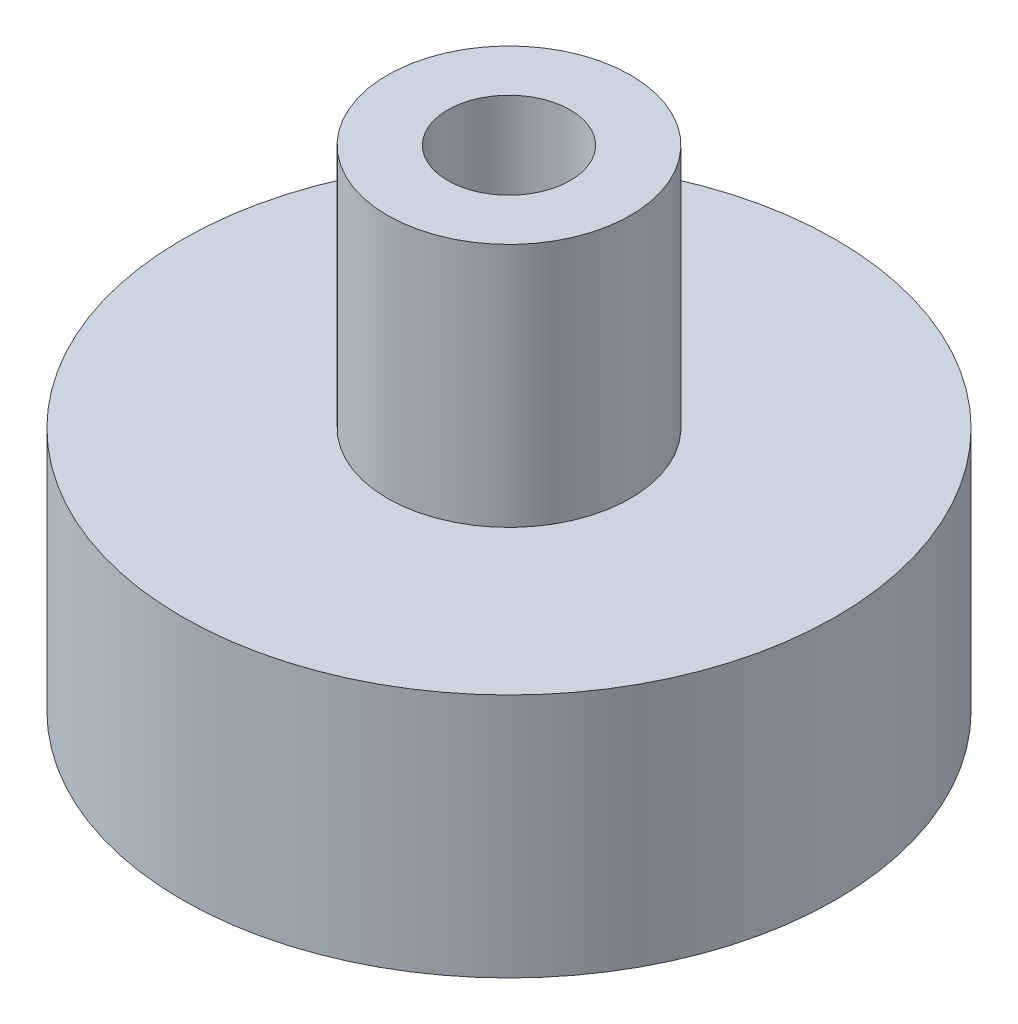
ISO-10303-21;
HEADER;
FILE_DESCRIPTION(('STEP AP214'),'2;1');
FILE_NAME('part.step','',(''),(''),'','','');
FILE_SCHEMA(('AUTOMOTIVE_DESIGN { 1 0 10303 214 1 1 1 1 }'));
ENDSEC;
DATA;
#1=APPLICATION_CONTEXT('core data for automotive mechanical design processes');
#2=APPLICATION_PROTOCOL_DEFINITION('international standard','automotive_design',2000,#1);
#3=PRODUCT_CONTEXT('',#1,'mechanical');
#4=PRODUCT('Part','Part','',(#3));
#5=PRODUCT_RELATED_PRODUCT_CATEGORY('part','',(#4));
#6=PRODUCT_DEFINITION_FORMATION('','',#4);
#7=PRODUCT_DEFINITION_CONTEXT('part definition',#1,'design');
#8=PRODUCT_DEFINITION('design','',#6,#7);
#9=PRODUCT_DEFINITION_SHAPE('','',#8);
#10=(LENGTH_UNIT() NAMED_UNIT(*) SI_UNIT(.MILLI.,.METRE.));
#11=(NAMED_UNIT(*) PLANE_ANGLE_UNIT() SI_UNIT($,.RADIAN.));
#12=(NAMED_UNIT(*) SI_UNIT($,.STERADIAN.) SOLID_ANGLE_UNIT());
#13=UNCERTAINTY_MEASURE_WITH_UNIT(LENGTH_MEASURE(1.E-05),#10,'distance_accuracy_value','');
#14=(GEOMETRIC_REPRESENTATION_CONTEXT(3) GLOBAL_UNCERTAINTY_ASSIGNED_CONTEXT((#13)) GLOBAL_UNIT_ASSIGNED_CONTEXT((#10,
#11,#12)) REPRESENTATION_CONTEXT('',''));
#15=CARTESIAN_POINT('',(0.,0.,0.));
#16=DIRECTION('',(0.,0.,1.));
#17=DIRECTION('',(1.,0.,0.));
#18=AXIS2_PLACEMENT_3D('',#15,#16,#17);
#19=CARTESIAN_POINT('',(-27.9181268796598,4.7625,5.99101435185832));
#20=DIRECTION('',(0.,1.,0.));
#21=DIRECTION('',(0.,0.,1.));
#22=AXIS2_PLACEMENT_3D('',#19,#20,#21);
#23=PLANE('',#22);
#24=CARTESIAN_POINT('',(-27.9181268796598,4.7625,5.99101435185832));
#25=DIRECTION('',(0.,1.,0.));
#26=DIRECTION('',(0.,0.,1.));
#27=AXIS2_PLACEMENT_3D('',#24,#25,#26);
#28=CIRCLE('',#27,6.35);
#29=CARTESIAN_POINT('',(-27.9181268796598,4.7625,-0.358985648141679));
#30=VERTEX_POINT('',#29);
#31=EDGE_CURVE('E10',#30,#30,#28,.T.);
#32=ORIENTED_EDGE('',*,*,#31,.T.);
#33=EDGE_LOOP('',(#32));
#34=FACE_BOUND('',#33,.T.);
#35=CARTESIAN_POINT('',(-27.9181268796598,4.7625,5.99101435185832));
#36=DIRECTION('',(0.,1.,0.));
#37=DIRECTION('',(0.,0.,1.));
#38=AXIS2_PLACEMENT_3D('',#35,#36,#37);
#39=CIRCLE('',#38,2.3622);
#40=CARTESIAN_POINT('',(-27.9181268796598,4.7625,8.35321435185833));
#41=VERTEX_POINT('',#40);
#42=EDGE_CURVE('E55',#41,#41,#39,.F.);
#43=ORIENTED_EDGE('',*,*,#42,.T.);
#44=EDGE_LOOP('',(#43));
#45=FACE_BOUND('',#44,.T.);
#46=ADVANCED_FACE('F37',(#34,#45),#23,.T.);
#47=CARTESIAN_POINT('',(-27.9181268796598,0.,5.99101435185832));
#48=DIRECTION('',(0.,1.,0.));
#49=DIRECTION('',(0.,0.,1.));
#50=AXIS2_PLACEMENT_3D('',#47,#48,#49);
#51=PLANE('',#50);
#52=CARTESIAN_POINT('',(-27.9181268796598,0.,5.99101435185832));
#53=DIRECTION('',(0.,1.,0.));
#54=DIRECTION('',(0.,0.,1.));
#55=AXIS2_PLACEMENT_3D('',#52,#53,#54);
#56=CIRCLE('',#55,1.190625);
#57=CARTESIAN_POINT('',(-27.9181268796598,0.,4.80038935185832));
#58=VERTEX_POINT('',#57);
#59=EDGE_CURVE('E50',#58,#58,#56,.T.);
#60=ORIENTED_EDGE('',*,*,#59,.T.);
#61=EDGE_LOOP('',(#60));
#62=FACE_BOUND('',#61,.T.);
#63=CARTESIAN_POINT('',(-27.9181268796598,0.,5.99101435185832));
#64=DIRECTION('',(0.,1.,0.));
#65=DIRECTION('',(0.,0.,1.));
#66=AXIS2_PLACEMENT_3D('',#63,#64,#65);
#67=CIRCLE('',#66,6.35);
#68=CARTESIAN_POINT('',(-27.9181268796598,0.,-0.358985648141679));
#69=VERTEX_POINT('',#68);
#70=EDGE_CURVE('E41',#69,#69,#67,.T.);
#71=ORIENTED_EDGE('',*,*,#70,.F.);
#72=EDGE_LOOP('',(#71));
#73=FACE_BOUND('',#72,.T.);
#74=ADVANCED_FACE('F84',(#62,#73),#51,.F.);
#75=CARTESIAN_POINT('',(-27.9181268796598,4.7625,5.99101435185832));
#76=DIRECTION('',(0.,-1.,0.));
#77=DIRECTION('',(0.,0.,-1.));
#78=AXIS2_PLACEMENT_3D('',#75,#76,#77);
#79=CYLINDRICAL_SURFACE('',#78,6.35);
#80=CARTESIAN_POINT('',(-27.9181268796598,4.7625,-0.358985648141679));
#81=CARTESIAN_POINT('',(-27.9181268796598,4.712890625,-0.358985648141679));
#82=CARTESIAN_POINT('',(-27.9181268796598,4.66328125,-0.358985648141679));
#83=CARTESIAN_POINT('',(-27.9181268796598,4.5640625,-0.358985648141679));
#84=CARTESIAN_POINT('',(-27.9181268796598,4.514453125,-0.358985648141679));
#85=CARTESIAN_POINT('',(-27.9181268796598,4.415234375,-0.358985648141679));
#86=CARTESIAN_POINT('',(-27.9181268796598,4.365625,-0.358985648141679));
#87=CARTESIAN_POINT('',(-27.9181268796598,4.26640625,-0.358985648141679));
#88=CARTESIAN_POINT('',(-27.9181268796598,4.216796875,-0.358985648141679));
#89=CARTESIAN_POINT('',(-27.9181268796598,4.117578125,-0.358985648141679));
#90=CARTESIAN_POINT('',(-27.9181268796598,4.06796875,-0.358985648141679));
#91=CARTESIAN_POINT('',(-27.9181268796598,3.96875,-0.358985648141679));
#92=CARTESIAN_POINT('',(-27.9181268796598,3.919140625,-0.358985648141679));
#93=CARTESIAN_POINT('',(-27.9181268796598,3.819921875,-0.358985648141679));
#94=CARTESIAN_POINT('',(-27.9181268796598,3.7703125,-0.358985648141679));
#95=CARTESIAN_POINT('',(-27.9181268796598,3.67109375,-0.358985648141679));
#96=CARTESIAN_POINT('',(-27.9181268796598,3.621484375,-0.358985648141679));
#97=CARTESIAN_POINT('',(-27.9181268796598,3.522265625,-0.358985648141679));
#98=CARTESIAN_POINT('',(-27.9181268796598,3.47265625,-0.358985648141679));
#99=CARTESIAN_POINT('',(-27.9181268796598,3.3734375,-0.358985648141679));
#100=CARTESIAN_POINT('',(-27.9181268796598,3.323828125,-0.358985648141679));
#101=CARTESIAN_POINT('',(-27.9181268796598,3.224609375,-0.358985648141679));
#102=CARTESIAN_POINT('',(-27.9181268796598,3.175,-0.358985648141679));
#103=CARTESIAN_POINT('',(-27.9181268796598,3.07578125,-0.358985648141679));
#104=CARTESIAN_POINT('',(-27.9181268796598,3.026171875,-0.358985648141679));
#105=CARTESIAN_POINT('',(-27.9181268796598,2.926953125,-0.358985648141679));
#106=CARTESIAN_POINT('',(-27.9181268796598,2.87734375,-0.358985648141679));
#107=CARTESIAN_POINT('',(-27.9181268796598,2.778125,-0.358985648141679));
#108=CARTESIAN_POINT('',(-27.9181268796598,2.728515625,-0.358985648141679));
#109=CARTESIAN_POINT('',(-27.9181268796598,2.629296875,-0.358985648141679));
#110=CARTESIAN_POINT('',(-27.9181268796598,2.5796875,-0.358985648141679));
#111=CARTESIAN_POINT('',(-27.9181268796598,2.48046875,-0.358985648141679));
#112=CARTESIAN_POINT('',(-27.9181268796598,2.430859375,-0.358985648141679));
#113=CARTESIAN_POINT('',(-27.9181268796598,2.331640625,-0.358985648141679));
#114=CARTESIAN_POINT('',(-27.9181268796598,2.28203125,-0.358985648141679));
#115=CARTESIAN_POINT('',(-27.9181268796598,2.1828125,-0.358985648141679));
#116=CARTESIAN_POINT('',(-27.9181268796598,2.133203125,-0.358985648141679));
#117=CARTESIAN_POINT('',(-27.9181268796598,2.033984375,-0.358985648141679));
#118=CARTESIAN_POINT('',(-27.9181268796598,1.984375,-0.358985648141679));
#119=CARTESIAN_POINT('',(-27.9181268796598,1.88515625,-0.358985648141679));
#120=CARTESIAN_POINT('',(-27.9181268796598,1.835546875,-0.358985648141679));
#121=CARTESIAN_POINT('',(-27.9181268796598,1.736328125,-0.358985648141679));
#122=CARTESIAN_POINT('',(-27.9181268796598,1.68671875,-0.358985648141679));
#123=CARTESIAN_POINT('',(-27.9181268796598,1.5875,-0.358985648141679));
#124=CARTESIAN_POINT('',(-27.9181268796598,1.537890625,-0.358985648141679));
#125=CARTESIAN_POINT('',(-27.9181268796598,1.438671875,-0.358985648141679));
#126=CARTESIAN_POINT('',(-27.9181268796598,1.3890625,-0.358985648141679));
#127=CARTESIAN_POINT('',(-27.9181268796598,1.28984375,-0.358985648141679));
#128=CARTESIAN_POINT('',(-27.9181268796598,1.240234375,-0.358985648141679));
#129=CARTESIAN_POINT('',(-27.9181268796598,1.141015625,-0.358985648141679));
#130=CARTESIAN_POINT('',(-27.9181268796598,1.09140625,-0.358985648141679));
#131=CARTESIAN_POINT('',(-27.9181268796598,0.992187499999999,-0.358985648141679));
#132=CARTESIAN_POINT('',(-27.9181268796598,0.942578124999999,-0.358985648141679));
#133=CARTESIAN_POINT('',(-27.9181268796598,0.843359375,-0.358985648141679));
#134=CARTESIAN_POINT('',(-27.9181268796598,0.79375,-0.358985648141679));
#135=CARTESIAN_POINT('',(-27.9181268796598,0.69453125,-0.358985648141679));
#136=CARTESIAN_POINT('',(-27.9181268796598,0.644921875,-0.358985648141679));
#137=CARTESIAN_POINT('',(-27.9181268796598,0.545703125,-0.358985648141679));
#138=CARTESIAN_POINT('',(-27.9181268796598,0.49609375,-0.358985648141679));
#139=CARTESIAN_POINT('',(-27.9181268796598,0.396875,-0.358985648141679));
#140=CARTESIAN_POINT('',(-27.9181268796598,0.347265625,-0.358985648141679));
#141=CARTESIAN_POINT('',(-27.9181268796598,0.248046875,-0.358985648141679));
#142=CARTESIAN_POINT('',(-27.9181268796598,0.1984375,-0.358985648141679));
#143=CARTESIAN_POINT('',(-27.9181268796598,0.09921875,-0.358985648141679));
#144=CARTESIAN_POINT('',(-27.9181268796598,0.049609375,-0.358985648141679));
#145=CARTESIAN_POINT('',(-27.9181268796598,0.,-0.358985648141679));
#146=B_SPLINE_CURVE_WITH_KNOTS('',3,(#80,#81,#82,#83,#84,#85,#86,#87,#88,#89,#90,#91,#92,#93,
#94,#95,#96,#97,#98,#99,#100,#101,#102,#103,#104,#105,#106,#107,#108,#109,#110,#111,#112,#113,
#114,#115,#116,#117,#118,#119,#120,#121,#122,#123,#124,#125,#126,#127,#128,#129,#130,#131,#132,
#133,#134,#135,#136,#137,#138,#139,#140,#141,#142,#143,#144,#145),.UNSPECIFIED.,.F.,.F.,(4,2,2,
2,2,2,2,2,2,2,2,2,2,2,2,2,2,2,2,2,2,2,2,2,2,2,2,2,2,2,2,2,4),(0.,0.148828125,0.29765625,
0.446484375,0.5953125,0.744140625,0.892968750000001,1.041796875,1.190625,1.339453125,1.48828125,
1.637109375,1.7859375,1.934765625,2.08359375,2.232421875,2.38125,2.530078125,2.67890625,
2.827734375,2.9765625,3.125390625,3.27421875,3.423046875,3.571875,3.720703125,3.86953125,
4.018359375,4.1671875,4.316015625,4.46484375,4.613671875,4.7625),.UNSPECIFIED.);
#147=EDGE_CURVE('BSEAM39',#30,#69,#146,.T.);
#148=ORIENTED_EDGE('',*,*,#31,.F.);
#149=ORIENTED_EDGE('',*,*,#70,.T.);
#150=ORIENTED_EDGE('',*,*,#147,.T.);
#151=ORIENTED_EDGE('',*,*,#147,.F.);
#152=EDGE_LOOP('',(#148,#150,#149,#151));
#153=FACE_BOUND('',#152,.T.);
#154=ADVANCED_FACE('F39',(#153),#79,.T.);
#155=CARTESIAN_POINT('',(-27.9181268796598,4.7625,5.99101435185832));
#156=DIRECTION('',(0.,-1.,0.));
#157=DIRECTION('',(0.,0.,-1.));
#158=AXIS2_PLACEMENT_3D('',#155,#156,#157);
#159=CYLINDRICAL_SURFACE('',#158,1.190625);
#160=CARTESIAN_POINT('',(-27.9181268796598,9.525,5.99101435185832));
#161=DIRECTION('',(0.,1.,0.));
#162=DIRECTION('',(0.,0.,1.));
#163=AXIS2_PLACEMENT_3D('',#160,#161,#162);
#164=CIRCLE('',#163,1.190625);
#165=CARTESIAN_POINT('',(-27.9181268796598,9.525,4.80038935185832));
#166=VERTEX_POINT('',#165);
#167=EDGE_CURVE('E63',#166,#166,#164,.T.);
#168=CARTESIAN_POINT('',(-27.9181268796598,0.,4.80038935185832));
#169=CARTESIAN_POINT('',(-27.9181268796598,0.0992187500000001,4.80038935185832));
#170=CARTESIAN_POINT('',(-27.9181268796598,0.1984375,4.80038935185832));
#171=CARTESIAN_POINT('',(-27.9181268796598,0.396875,4.80038935185832));
#172=CARTESIAN_POINT('',(-27.9181268796598,0.49609375,4.80038935185832));
#173=CARTESIAN_POINT('',(-27.9181268796598,0.69453125,4.80038935185832));
#174=CARTESIAN_POINT('',(-27.9181268796598,0.79375,4.80038935185832));
#175=CARTESIAN_POINT('',(-27.9181268796598,0.992187499999999,4.80038935185832));
#176=CARTESIAN_POINT('',(-27.9181268796598,1.09140625,4.80038935185832));
#177=CARTESIAN_POINT('',(-27.9181268796598,1.28984375,4.80038935185832));
#178=CARTESIAN_POINT('',(-27.9181268796598,1.3890625,4.80038935185832));
#179=CARTESIAN_POINT('',(-27.9181268796598,1.5875,4.80038935185832));
#180=CARTESIAN_POINT('',(-27.9181268796598,1.68671875,4.80038935185832));
#181=CARTESIAN_POINT('',(-27.9181268796598,1.88515625,4.80038935185832));
#182=CARTESIAN_POINT('',(-27.9181268796598,1.984375,4.80038935185832));
#183=CARTESIAN_POINT('',(-27.9181268796598,2.1828125,4.80038935185832));
#184=CARTESIAN_POINT('',(-27.9181268796598,2.28203125,4.80038935185832));
#185=CARTESIAN_POINT('',(-27.9181268796598,2.48046875,4.80038935185832));
#186=CARTESIAN_POINT('',(-27.9181268796598,2.5796875,4.80038935185832));
#187=CARTESIAN_POINT('',(-27.9181268796598,2.778125,4.80038935185832));
#188=CARTESIAN_POINT('',(-27.9181268796598,2.87734375,4.80038935185832));
#189=CARTESIAN_POINT('',(-27.9181268796598,3.07578125,4.80038935185832));
#190=CARTESIAN_POINT('',(-27.9181268796598,3.175,4.80038935185832));
#191=CARTESIAN_POINT('',(-27.9181268796598,3.3734375,4.80038935185832));
#192=CARTESIAN_POINT('',(-27.9181268796598,3.47265625,4.80038935185832));
#193=CARTESIAN_POINT('',(-27.9181268796598,3.67109375,4.80038935185832));
#194=CARTESIAN_POINT('',(-27.9181268796598,3.7703125,4.80038935185832));
#195=CARTESIAN_POINT('',(-27.9181268796598,3.96875,4.80038935185832));
#196=CARTESIAN_POINT('',(-27.9181268796598,4.06796875,4.80038935185832));
#197=CARTESIAN_POINT('',(-27.9181268796598,4.26640625,4.80038935185832));
#198=CARTESIAN_POINT('',(-27.9181268796598,4.365625,4.80038935185832));
#199=CARTESIAN_POINT('',(-27.9181268796598,4.5640625,4.80038935185832));
#200=CARTESIAN_POINT('',(-27.9181268796598,4.66328125,4.80038935185832));
#201=CARTESIAN_POINT('',(-27.9181268796598,4.86171875,4.80038935185832));
#202=CARTESIAN_POINT('',(-27.9181268796598,4.9609375,4.80038935185832));
#203=CARTESIAN_POINT('',(-27.9181268796598,5.159375,4.80038935185832));
#204=CARTESIAN_POINT('',(-27.9181268796598,5.25859375,4.80038935185832));
#205=CARTESIAN_POINT('',(-27.9181268796598,5.45703125,4.80038935185832));
#206=CARTESIAN_POINT('',(-27.9181268796598,5.55625,4.80038935185832));
#207=CARTESIAN_POINT('',(-27.9181268796598,5.7546875,4.80038935185832));
#208=CARTESIAN_POINT('',(-27.9181268796598,5.85390625,4.80038935185832));
#209=CARTESIAN_POINT('',(-27.9181268796598,6.05234375,4.80038935185832));
#210=CARTESIAN_POINT('',(-27.9181268796598,6.1515625,4.80038935185832));
#211=CARTESIAN_POINT('',(-27.9181268796598,6.35,4.80038935185832));
#212=CARTESIAN_POINT('',(-27.9181268796598,6.44921875,4.80038935185832));
#213=CARTESIAN_POINT('',(-27.9181268796598,6.64765625,4.80038935185832));
#214=CARTESIAN_POINT('',(-27.9181268796598,6.746875,4.80038935185832));
#215=CARTESIAN_POINT('',(-27.9181268796598,6.9453125,4.80038935185832));
#216=CARTESIAN_POINT('',(-27.9181268796598,7.04453125,4.80038935185832));
#217=CARTESIAN_POINT('',(-27.9181268796598,7.24296875,4.80038935185832));
#218=CARTESIAN_POINT('',(-27.9181268796598,7.3421875,4.80038935185832));
#219=CARTESIAN_POINT('',(-27.9181268796598,7.540625,4.80038935185832));
#220=CARTESIAN_POINT('',(-27.9181268796598,7.63984375,4.80038935185832));
#221=CARTESIAN_POINT('',(-27.9181268796598,7.83828125,4.80038935185832));
#222=CARTESIAN_POINT('',(-27.9181268796598,7.9375,4.80038935185832));
#223=CARTESIAN_POINT('',(-27.9181268796598,8.1359375,4.80038935185832));
#224=CARTESIAN_POINT('',(-27.9181268796598,8.23515625,4.80038935185832));
#225=CARTESIAN_POINT('',(-27.9181268796598,8.43359375,4.80038935185832));
#226=CARTESIAN_POINT('',(-27.9181268796598,8.5328125,4.80038935185832));
#227=CARTESIAN_POINT('',(-27.9181268796598,8.73125,4.80038935185832));
#228=CARTESIAN_POINT('',(-27.9181268796598,8.83046875,4.80038935185832));
#229=CARTESIAN_POINT('',(-27.9181268796598,9.02890625,4.80038935185832));
#230=CARTESIAN_POINT('',(-27.9181268796598,9.128125,4.80038935185832));
#231=CARTESIAN_POINT('',(-27.9181268796598,9.3265625,4.80038935185832));
#232=CARTESIAN_POINT('',(-27.9181268796598,9.42578125,4.80038935185832));
#233=CARTESIAN_POINT('',(-27.9181268796598,9.525,4.80038935185832));
#234=B_SPLINE_CURVE_WITH_KNOTS('',3,(#168,#169,#170,#171,#172,#173,#174,#175,#176,#177,#178,
#179,#180,#181,#182,#183,#184,#185,#186,#187,#188,#189,#190,#191,#192,#193,#194,#195,#196,#197,
#198,#199,#200,#201,#202,#203,#204,#205,#206,#207,#208,#209,#210,#211,#212,#213,#214,#215,#216,
#217,#218,#219,#220,#221,#222,#223,#224,#225,#226,#227,#228,#229,#230,#231,#232,#233),
.UNSPECIFIED.,.F.,.F.,(4,2,2,2,2,2,2,2,2,2,2,2,2,2,2,2,2,2,2,2,2,2,2,2,2,2,2,2,2,2,2,2,4),(0.,
0.29765625,0.5953125,0.892968749999999,1.190625,1.48828125,1.7859375,2.08359375,2.38125,
2.67890625,2.9765625,3.27421875,3.571875,3.86953125,4.1671875,4.46484375,4.7625,5.06015625,
5.3578125,5.65546875,5.953125,6.25078125,6.5484375,6.84609375,7.14375,7.44140625,7.7390625,
8.03671875,8.334375,8.63203125,8.9296875,9.22734375,9.525),.UNSPECIFIED.);
#235=EDGE_CURVE('BSEAM68',#58,#166,#234,.T.);
#236=ORIENTED_EDGE('',*,*,#59,.F.);
#237=ORIENTED_EDGE('',*,*,#167,.T.);
#238=ORIENTED_EDGE('',*,*,#235,.T.);
#239=ORIENTED_EDGE('',*,*,#235,.F.);
#240=EDGE_LOOP('',(#236,#238,#237,#239));
#241=FACE_BOUND('',#240,.T.);
#242=ADVANCED_FACE('F68',(#241),#159,.F.);
#243=CARTESIAN_POINT('',(-27.9181268796598,9.525,5.99101435185832));
#244=DIRECTION('',(0.,1.,0.));
#245=DIRECTION('',(0.,0.,1.));
#246=AXIS2_PLACEMENT_3D('',#243,#244,#245);
#247=PLANE('',#246);
#248=CARTESIAN_POINT('',(-27.9181268796598,9.525,5.99101435185832));
#249=DIRECTION('',(0.,1.,0.));
#250=DIRECTION('',(0.,0.,1.));
#251=AXIS2_PLACEMENT_3D('',#248,#249,#250);
#252=CIRCLE('',#251,2.3622);
#253=CARTESIAN_POINT('',(-27.9181268796598,9.525,8.35321435185833));
#254=VERTEX_POINT('',#253);
#255=EDGE_CURVE('E59',#254,#254,#252,.T.);
#256=ORIENTED_EDGE('',*,*,#255,.T.);
#257=EDGE_LOOP('',(#256));
#258=FACE_BOUND('',#257,.T.);
#259=ORIENTED_EDGE('',*,*,#167,.F.);
#260=EDGE_LOOP('',(#259));
#261=FACE_BOUND('',#260,.T.);
#262=ADVANCED_FACE('F70',(#258,#261),#247,.T.);
#263=CARTESIAN_POINT('',(-27.9181268796598,9.525,5.99101435185832));
#264=DIRECTION('',(0.,-1.,0.));
#265=DIRECTION('',(0.,0.,-1.));
#266=AXIS2_PLACEMENT_3D('',#263,#264,#265);
#267=CYLINDRICAL_SURFACE('',#266,2.3622);
#268=ORIENTED_EDGE('',*,*,#42,.F.);
#269=EDGE_LOOP('',(#268));
#270=FACE_BOUND('',#269,.T.);
#271=ORIENTED_EDGE('',*,*,#255,.F.);
#272=EDGE_LOOP('',(#271));
#273=FACE_BOUND('',#272,.T.);
#274=ADVANCED_FACE('F72',(#270,#273),#267,.T.);
#275=CLOSED_SHELL('',(#46,#74,#154,#242,#262,#274));
#276=MANIFOLD_SOLID_BREP('B2',#275);
#277=ADVANCED_BREP_SHAPE_REPRESENTATION('',(#18,#276),#14);
#278=SHAPE_DEFINITION_REPRESENTATION(#9,#277);
ENDSEC;
END-ISO-10303-21;
